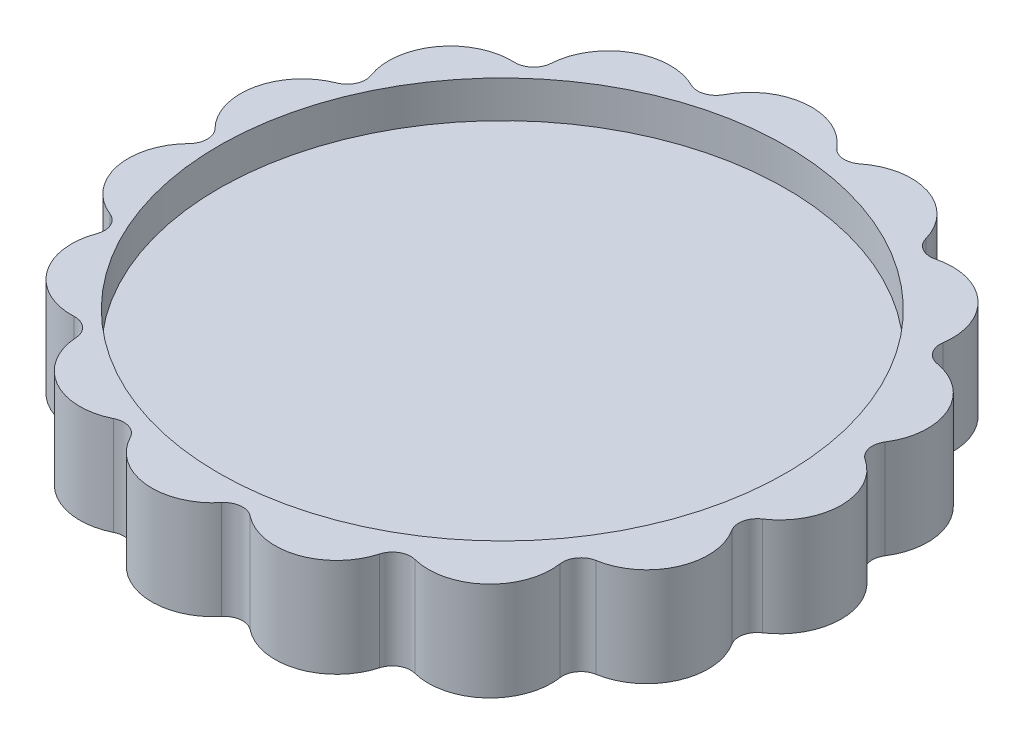
ISO-10303-21;
HEADER;
FILE_DESCRIPTION(('STEP AP214'),'2;1');
FILE_NAME('part.step','',(''),(''),'','','');
FILE_SCHEMA(('AUTOMOTIVE_DESIGN { 1 0 10303 214 1 1 1 1 }'));
ENDSEC;
DATA;
#1=APPLICATION_CONTEXT('core data for automotive mechanical design processes');
#2=APPLICATION_PROTOCOL_DEFINITION('international standard','automotive_design',2000,#1);
#3=PRODUCT_CONTEXT('',#1,'mechanical');
#4=PRODUCT('Part','Part','',(#3));
#5=PRODUCT_RELATED_PRODUCT_CATEGORY('part','',(#4));
#6=PRODUCT_DEFINITION_FORMATION('','',#4);
#7=PRODUCT_DEFINITION_CONTEXT('part definition',#1,'design');
#8=PRODUCT_DEFINITION('design','',#6,#7);
#9=PRODUCT_DEFINITION_SHAPE('','',#8);
#10=(LENGTH_UNIT() NAMED_UNIT(*) SI_UNIT(.MILLI.,.METRE.));
#11=(NAMED_UNIT(*) PLANE_ANGLE_UNIT() SI_UNIT($,.RADIAN.));
#12=(NAMED_UNIT(*) SI_UNIT($,.STERADIAN.) SOLID_ANGLE_UNIT());
#13=UNCERTAINTY_MEASURE_WITH_UNIT(LENGTH_MEASURE(1.E-05),#10,'distance_accuracy_value','');
#14=(GEOMETRIC_REPRESENTATION_CONTEXT(3) GLOBAL_UNCERTAINTY_ASSIGNED_CONTEXT((#13)) GLOBAL_UNIT_ASSIGNED_CONTEXT((#10,
#11,#12)) REPRESENTATION_CONTEXT('',''));
#15=CARTESIAN_POINT('',(0.,0.,0.));
#16=DIRECTION('',(0.,0.,1.));
#17=DIRECTION('',(1.,0.,0.));
#18=AXIS2_PLACEMENT_3D('',#15,#16,#17);
#19=CARTESIAN_POINT('',(0.,8.,0.));
#20=DIRECTION('',(0.,1.,0.));
#21=DIRECTION('',(0.,0.,1.));
#22=AXIS2_PLACEMENT_3D('',#19,#20,#21);
#23=PLANE('',#22);
#24=CARTESIAN_POINT('',(0.,8.,0.));
#25=DIRECTION('',(0.,1.,0.));
#26=DIRECTION('',(0.,0.,1.));
#27=AXIS2_PLACEMENT_3D('',#24,#25,#26);
#28=CIRCLE('',#27,23.);
#29=CARTESIAN_POINT('',(0.,8.,23.));
#30=VERTEX_POINT('',#29);
#31=EDGE_CURVE('E937',#30,#30,#28,.T.);
#32=ORIENTED_EDGE('',*,*,#31,.F.);
#33=EDGE_LOOP('',(#32));
#34=FACE_BOUND('',#33,.T.);
#35=CARTESIAN_POINT('',(20.6082024489469,8.,8.90020771972226));
#36=DIRECTION('',(0.,1.,0.));
#37=DIRECTION('',(-0.406736643075789,0.,0.913545457642606));
#38=AXIS2_PLACEMENT_3D('',#35,#36,#37);
#39=CIRCLE('',#38,5.);
#40=CARTESIAN_POINT('',(21.4402304030813,8.,13.830494677247));
#41=VERTEX_POINT('',#40);
#42=CARTESIAN_POINT('',(24.8288550590076,8.,6.21951908707809));
#43=VERTEX_POINT('',#42);
#44=EDGE_CURVE('E932',#41,#43,#39,.T.);
#45=ORIENTED_EDGE('',*,*,#44,.T.);
#46=CARTESIAN_POINT('',(26.0950508420258,8.,5.41531249728484));
#47=DIRECTION('',(0.,1.,0.));
#48=DIRECTION('',(0.,0.,1.));
#49=AXIS2_PLACEMENT_3D('',#46,#47,#48);
#50=CIRCLE('',#49,1.5);
#51=CARTESIAN_POINT('',(25.2654237246353,8.,4.16562499791141));
#52=VERTEX_POINT('',#51);
#53=EDGE_CURVE('E376',#43,#52,#50,.F.);
#54=ORIENTED_EDGE('',*,*,#53,.T.);
#55=CARTESIAN_POINT('',(22.5,8.,0.));
#56=DIRECTION('',(0.,1.,0.));
#57=DIRECTION('',(0.,0.,1.));
#58=AXIS2_PLACEMENT_3D('',#55,#56,#57);
#59=CIRCLE('',#58,5.);
#60=CARTESIAN_POINT('',(25.2654237246351,8.,-4.16562499791152));
#61=VERTEX_POINT('',#60);
#62=EDGE_CURVE('E455',#52,#61,#59,.T.);
#63=ORIENTED_EDGE('',*,*,#62,.T.);
#64=CARTESIAN_POINT('',(26.0950508420256,8.,-5.41531249728497));
#65=DIRECTION('',(0.,1.,0.));
#66=DIRECTION('',(0.,0.,1.));
#67=AXIS2_PLACEMENT_3D('',#64,#65,#66);
#68=CIRCLE('',#67,1.5);
#69=CARTESIAN_POINT('',(24.8288550590074,8.,-6.21951908707826));
#70=VERTEX_POINT('',#69);
#71=EDGE_CURVE('E381',#61,#70,#68,.F.);
#72=ORIENTED_EDGE('',*,*,#71,.T.);
#73=CARTESIAN_POINT('',(20.6082024489468,8.,-8.90020771972253));
#74=DIRECTION('',(0.,1.,0.));
#75=DIRECTION('',(0.406736643075801,0.,0.913545457642601));
#76=AXIS2_PLACEMENT_3D('',#73,#74,#75);
#77=CIRCLE('',#76,5.);
#78=CARTESIAN_POINT('',(21.4402304030811,8.,-13.8304946772473));
#79=VERTEX_POINT('',#78);
#80=EDGE_CURVE('E239',#70,#79,#77,.T.);
#81=ORIENTED_EDGE('',*,*,#80,.T.);
#82=CARTESIAN_POINT('',(21.6898387893214,8.,-15.3095807645048));
#83=DIRECTION('',(0.,1.,0.));
#84=DIRECTION('',(0.,0.,1.));
#85=AXIS2_PLACEMENT_3D('',#82,#83,#84);
#86=CIRCLE('',#85,1.5);
#87=CARTESIAN_POINT('',(20.2060110945869,8.,-15.5292518193551));
#88=VERTEX_POINT('',#87);
#89=EDGE_CURVE('E233',#79,#88,#86,.F.);
#90=ORIENTED_EDGE('',*,*,#89,.T.);
#91=CARTESIAN_POINT('',(15.2599187788055,8.,-16.2614886688562));
#92=DIRECTION('',(0.,1.,0.));
#93=DIRECTION('',(0.743144825477395,0.,0.669130606358857));
#94=AXIS2_PLACEMENT_3D('',#91,#92,#93);
#95=CIRCLE('',#94,5.);
#96=CARTESIAN_POINT('',(14.0146857704325,8.,-21.1039461807874));
#97=VERTEX_POINT('',#96);
#98=EDGE_CURVE('E236',#88,#97,#95,.T.);
#99=ORIENTED_EDGE('',*,*,#98,.T.);
#100=CARTESIAN_POINT('',(13.6411158679206,8.,-22.5566834343667));
#101=DIRECTION('',(0.,1.,0.));
#102=DIRECTION('',(0.,0.,1.));
#103=AXIS2_PLACEMENT_3D('',#100,#101,#102);
#104=CIRCLE('',#103,1.5);
#105=CARTESIAN_POINT('',(12.1962235500409,8.,-22.1538358332416));
#106=VERTEX_POINT('',#105);
#107=EDGE_CURVE('E334',#97,#106,#104,.F.);
#108=ORIENTED_EDGE('',*,*,#107,.T.);
#109=CARTESIAN_POINT('',(7.37991582377525,8.,-20.811010496158));
#110=DIRECTION('',(0.,1.,0.));
#111=DIRECTION('',(0.951056516295154,0.,0.309016994374945));
#112=AXIS2_PLACEMENT_3D('',#109,#110,#111);
#113=CIRCLE('',#112,5.);
#114=CARTESIAN_POINT('',(4.27273395262942,8.,-24.7283336663371));
#115=VERTEX_POINT('',#114);
#116=EDGE_CURVE('E444',#106,#115,#113,.T.);
#117=ORIENTED_EDGE('',*,*,#116,.T.);
#118=CARTESIAN_POINT('',(3.34057939128567,8.,-25.9035306173909));
#119=DIRECTION('',(0.,1.,0.));
#120=DIRECTION('',(0.,0.,1.));
#121=AXIS2_PLACEMENT_3D('',#118,#119,#120);
#122=CIRCLE('',#121,1.5);
#123=CARTESIAN_POINT('',(2.18445745845675,8.,-24.9478203702804));
#124=VERTEX_POINT('',#123);
#125=EDGE_CURVE('E338',#115,#124,#122,.F.);
#126=ORIENTED_EDGE('',*,*,#125,.T.);
#127=CARTESIAN_POINT('',(-1.66928231763964,8.,-21.7621195465789));
#128=DIRECTION('',(0.,1.,0.));
#129=DIRECTION('',(0.994521895368273,0.,-0.104528463267657));
#130=AXIS2_PLACEMENT_3D('',#127,#128,#129);
#131=CIRCLE('',#130,5.);
#132=CARTESIAN_POINT('',(-6.10115307817609,8.,-24.0769676111184));
#133=VERTEX_POINT('',#132);
#134=EDGE_CURVE('E438',#124,#133,#131,.T.);
#135=ORIENTED_EDGE('',*,*,#134,.T.);
#136=CARTESIAN_POINT('',(-7.43071430633703,8.,-24.7714220304802));
#137=DIRECTION('',(0.,1.,0.));
#138=DIRECTION('',(0.,0.,1.));
#139=AXIS2_PLACEMENT_3D('',#136,#137,#138);
#140=CIRCLE('',#139,1.5);
#141=CARTESIAN_POINT('',(-8.09816186889102,8.,-23.4281001214648));
#142=VERTEX_POINT('',#141);
#143=EDGE_CURVE('E342',#133,#142,#140,.F.);
#144=ORIENTED_EDGE('',*,*,#143,.T.);
#145=CARTESIAN_POINT('',(-10.3229870774043,8.,-18.9503604247469));
#146=DIRECTION('',(0.,1.,0.));
#147=DIRECTION('',(0.866025403784436,0.,-0.500000000000004));
#148=AXIS2_PLACEMENT_3D('',#145,#146,#147);
#149=CIRCLE('',#148,5.);
#150=CARTESIAN_POINT('',(-15.3132360105527,8.,-19.2624751235533));
#151=VERTEX_POINT('',#150);
#152=EDGE_CURVE('E432',#142,#151,#149,.T.);
#153=ORIENTED_EDGE('',*,*,#152,.T.);
#154=CARTESIAN_POINT('',(-16.8103106904973,8.,-19.3561095331952));
#155=DIRECTION('',(0.,1.,0.));
#156=DIRECTION('',(0.,0.,1.));
#157=AXIS2_PLACEMENT_3D('',#154,#155,#156);
#158=CIRCLE('',#157,1.5);
#159=CARTESIAN_POINT('',(-16.87367613564,8.,-17.8574485240401));
#160=VERTEX_POINT('',#159);
#161=EDGE_CURVE('E346',#151,#160,#158,.F.);
#162=ORIENTED_EDGE('',*,*,#161,.T.);
#163=CARTESIAN_POINT('',(-17.0848942861158,8.,-12.8619118268563));
#164=DIRECTION('',(0.,1.,0.));
#165=DIRECTION('',(0.587785252292469,0.,-0.80901699437495));
#166=AXIS2_PLACEMENT_3D('',#163,#164,#165);
#167=CIRCLE('',#166,5.);
#168=CARTESIAN_POINT('',(-21.7706620163465,8.,-11.117325693033));
#169=VERTEX_POINT('',#168);
#170=EDGE_CURVE('E426',#160,#169,#167,.T.);
#171=ORIENTED_EDGE('',*,*,#170,.T.);
#172=CARTESIAN_POINT('',(-23.1763923354157,8.,-10.593949852886));
#173=DIRECTION('',(0.,1.,0.));
#174=DIRECTION('',(0.,0.,1.));
#175=AXIS2_PLACEMENT_3D('',#172,#173,#174);
#176=CIRCLE('',#175,1.5);
#177=CARTESIAN_POINT('',(-22.624719202025,8.,-9.19908184698192));
#178=VERTEX_POINT('',#177);
#179=EDGE_CURVE('E350',#169,#178,#176,.F.);
#180=ORIENTED_EDGE('',*,*,#179,.T.);
#181=CARTESIAN_POINT('',(-20.7858087573893,8.,-4.54952182730159));
#182=DIRECTION('',(0.,1.,0.));
#183=DIRECTION('',(0.207911690817753,0.,-0.978147600733807));
#184=AXIS2_PLACEMENT_3D('',#181,#182,#183);
#185=CIRCLE('',#184,5.);
#186=CARTESIAN_POINT('',(-24.3568834752819,8.,-1.04988965245408));
#187=VERTEX_POINT('',#186);
#188=EDGE_CURVE('E420',#178,#187,#185,.T.);
#189=ORIENTED_EDGE('',*,*,#188,.T.);
#190=CARTESIAN_POINT('',(-25.4282058906497,8.,1.74941733164748E-13));
#191=DIRECTION('',(0.,1.,0.));
#192=DIRECTION('',(0.,0.,1.));
#193=AXIS2_PLACEMENT_3D('',#190,#191,#192);
#194=CIRCLE('',#193,1.5);
#195=CARTESIAN_POINT('',(-24.3568834752819,8.,1.04988965245441));
#196=VERTEX_POINT('',#195);
#197=EDGE_CURVE('E354',#187,#196,#194,.F.);
#198=ORIENTED_EDGE('',*,*,#197,.T.);
#199=CARTESIAN_POINT('',(-20.7858087573892,8.,4.54952182730187));
#200=DIRECTION('',(0.,1.,0.));
#201=DIRECTION('',(-0.207911690817766,0.,-0.978147600733804));
#202=AXIS2_PLACEMENT_3D('',#199,#200,#201);
#203=CIRCLE('',#202,5.);
#204=CARTESIAN_POINT('',(-22.6247192020249,8.,9.19908184698223));
#205=VERTEX_POINT('',#204);
#206=EDGE_CURVE('E397',#196,#205,#203,.T.);
#207=ORIENTED_EDGE('',*,*,#206,.T.);
#208=CARTESIAN_POINT('',(-23.1763923354155,8.,10.5939498528863));
#209=DIRECTION('',(0.,1.,0.));
#210=DIRECTION('',(0.,0.,1.));
#211=AXIS2_PLACEMENT_3D('',#208,#209,#210);
#212=CIRCLE('',#211,1.5);
#213=CARTESIAN_POINT('',(-21.7706620163463,8.,11.1173256930333));
#214=VERTEX_POINT('',#213);
#215=EDGE_CURVE('E358',#205,#214,#212,.F.);
#216=ORIENTED_EDGE('',*,*,#215,.T.);
#217=CARTESIAN_POINT('',(-17.0848942861156,8.,12.8619118268566));
#218=DIRECTION('',(0.,1.,0.));
#219=DIRECTION('',(-0.58778525229248,0.,-0.809016994374943));
#220=AXIS2_PLACEMENT_3D('',#217,#218,#219);
#221=CIRCLE('',#220,5.);
#222=CARTESIAN_POINT('',(-16.8736761356398,8.,17.8574485240403));
#223=VERTEX_POINT('',#222);
#224=EDGE_CURVE('E398',#214,#223,#221,.T.);
#225=ORIENTED_EDGE('',*,*,#224,.T.);
#226=CARTESIAN_POINT('',(-16.810310690497,8.,19.3561095331955));
#227=DIRECTION('',(0.,1.,0.));
#228=DIRECTION('',(0.,0.,1.));
#229=AXIS2_PLACEMENT_3D('',#226,#227,#228);
#230=CIRCLE('',#229,1.5);
#231=CARTESIAN_POINT('',(-15.3132360105525,8.,19.2624751235535));
#232=VERTEX_POINT('',#231);
#233=EDGE_CURVE('E11',#223,#232,#230,.F.);
#234=ORIENTED_EDGE('',*,*,#233,.T.);
#235=CARTESIAN_POINT('',(-10.3229870774041,8.,18.950360424747));
#236=DIRECTION('',(0.,1.,0.));
#237=DIRECTION('',(-0.866025403784443,0.,-0.499999999999992));
#238=AXIS2_PLACEMENT_3D('',#235,#236,#237);
#239=CIRCLE('',#238,5.);
#240=CARTESIAN_POINT('',(-8.0981618688907,8.,23.428100121465));
#241=VERTEX_POINT('',#240);
#242=EDGE_CURVE('E403',#232,#241,#239,.T.);
#243=ORIENTED_EDGE('',*,*,#242,.T.);
#244=CARTESIAN_POINT('',(-7.43071430633669,8.,24.7714220304803));
#245=DIRECTION('',(0.,1.,0.));
#246=DIRECTION('',(0.,0.,1.));
#247=AXIS2_PLACEMENT_3D('',#244,#245,#246);
#248=CIRCLE('',#247,1.5);
#249=CARTESIAN_POINT('',(-6.10115307817576,8.,24.0769676111185));
#250=VERTEX_POINT('',#249);
#251=EDGE_CURVE('E362',#241,#250,#248,.F.);
#252=ORIENTED_EDGE('',*,*,#251,.T.);
#253=CARTESIAN_POINT('',(-1.66928231763935,8.,21.762119546579));
#254=DIRECTION('',(0.,1.,0.));
#255=DIRECTION('',(-0.994521895368274,0.,-0.104528463267644));
#256=AXIS2_PLACEMENT_3D('',#253,#254,#255);
#257=CIRCLE('',#256,5.);
#258=CARTESIAN_POINT('',(2.18445745845708,8.,24.9478203702804));
#259=VERTEX_POINT('',#258);
#260=EDGE_CURVE('E412',#250,#259,#257,.T.);
#261=ORIENTED_EDGE('',*,*,#260,.T.);
#262=CARTESIAN_POINT('',(3.34057939128601,8.,25.9035306173909));
#263=DIRECTION('',(0.,1.,0.));
#264=DIRECTION('',(0.,0.,1.));
#265=AXIS2_PLACEMENT_3D('',#262,#263,#264);
#266=CIRCLE('',#265,1.5);
#267=CARTESIAN_POINT('',(4.27273395262974,8.,24.7283336663371));
#268=VERTEX_POINT('',#267);
#269=EDGE_CURVE('E366',#259,#268,#266,.F.);
#270=ORIENTED_EDGE('',*,*,#269,.T.);
#271=CARTESIAN_POINT('',(7.37991582377552,8.,20.8110104961579));
#272=DIRECTION('',(0.,1.,0.));
#273=DIRECTION('',(-0.95105651629515,0.,0.309016994374957));
#274=AXIS2_PLACEMENT_3D('',#271,#272,#273);
#275=CIRCLE('',#274,5.);
#276=CARTESIAN_POINT('',(12.1962235500412,8.,22.1538358332415));
#277=VERTEX_POINT('',#276);
#278=EDGE_CURVE('E918',#268,#277,#275,.T.);
#279=ORIENTED_EDGE('',*,*,#278,.T.);
#280=CARTESIAN_POINT('',(13.6411158679209,8.,22.5566834343666));
#281=DIRECTION('',(0.,1.,0.));
#282=DIRECTION('',(0.,0.,1.));
#283=AXIS2_PLACEMENT_3D('',#280,#281,#282);
#284=CIRCLE('',#283,1.5);
#285=CARTESIAN_POINT('',(14.0146857704328,8.,21.1039461807872));
#286=VERTEX_POINT('',#285);
#287=EDGE_CURVE('E370',#277,#286,#284,.F.);
#288=ORIENTED_EDGE('',*,*,#287,.T.);
#289=CARTESIAN_POINT('',(15.2599187788057,8.,16.261488668856));
#290=DIRECTION('',(0.,1.,0.));
#291=DIRECTION('',(-0.743144825477386,0.,0.669130606358867));
#292=AXIS2_PLACEMENT_3D('',#289,#290,#291);
#293=CIRCLE('',#292,5.);
#294=CARTESIAN_POINT('',(20.2060110945872,8.,15.5292518193548));
#295=VERTEX_POINT('',#294);
#296=EDGE_CURVE('E926',#286,#295,#293,.T.);
#297=ORIENTED_EDGE('',*,*,#296,.T.);
#298=CARTESIAN_POINT('',(21.6898387893216,8.,15.3095807645045));
#299=DIRECTION('',(0.,1.,0.));
#300=DIRECTION('',(0.,0.,1.));
#301=AXIS2_PLACEMENT_3D('',#298,#299,#300);
#302=CIRCLE('',#301,1.5);
#303=EDGE_CURVE('E374',#295,#41,#302,.F.);
#304=ORIENTED_EDGE('',*,*,#303,.T.);
#305=EDGE_LOOP('',(#45,#54,#63,#72,#81,#90,#99,#108,#117,#126,#135,#144,#153,#162,#171,#180,
#189,#198,#207,#216,#225,#234,#243,#252,#261,#270,#279,#288,#297,#304));
#306=FACE_BOUND('',#305,.T.);
#307=ADVANCED_FACE('F35',(#34,#306),#23,.T.);
#308=CARTESIAN_POINT('',(0.,0.,0.));
#309=DIRECTION('',(0.,1.,0.));
#310=DIRECTION('',(0.,0.,1.));
#311=AXIS2_PLACEMENT_3D('',#308,#309,#310);
#312=PLANE('',#311);
#313=CARTESIAN_POINT('',(20.6082024489468,0.,-8.90020771972253));
#314=DIRECTION('',(0.,1.,0.));
#315=DIRECTION('',(0.406736643075801,0.,0.913545457642601));
#316=AXIS2_PLACEMENT_3D('',#313,#314,#315);
#317=CIRCLE('',#316,5.);
#318=CARTESIAN_POINT('',(24.8288550590074,0.,-6.21951908707826));
#319=VERTEX_POINT('',#318);
#320=CARTESIAN_POINT('',(21.4402304030811,0.,-13.8304946772473));
#321=VERTEX_POINT('',#320);
#322=EDGE_CURVE('E452',#319,#321,#317,.T.);
#323=ORIENTED_EDGE('',*,*,#322,.F.);
#324=CARTESIAN_POINT('',(26.0950508420256,0.,-5.41531249728497));
#325=DIRECTION('',(0.,1.,0.));
#326=DIRECTION('',(0.,0.,1.));
#327=AXIS2_PLACEMENT_3D('',#324,#325,#326);
#328=CIRCLE('',#327,1.5);
#329=CARTESIAN_POINT('',(25.2654237246351,0.,-4.16562499791152));
#330=VERTEX_POINT('',#329);
#331=EDGE_CURVE('E50',#319,#330,#328,.T.);
#332=ORIENTED_EDGE('',*,*,#331,.T.);
#333=CARTESIAN_POINT('',(22.5,0.,0.));
#334=DIRECTION('',(0.,1.,0.));
#335=DIRECTION('',(0.,0.,1.));
#336=AXIS2_PLACEMENT_3D('',#333,#334,#335);
#337=CIRCLE('',#336,5.);
#338=CARTESIAN_POINT('',(25.2654237246353,0.,4.16562499791141));
#339=VERTEX_POINT('',#338);
#340=EDGE_CURVE('E263',#339,#330,#337,.T.);
#341=ORIENTED_EDGE('',*,*,#340,.F.);
#342=CARTESIAN_POINT('',(26.0950508420258,0.,5.41531249728484));
#343=DIRECTION('',(0.,1.,0.));
#344=DIRECTION('',(0.,0.,1.));
#345=AXIS2_PLACEMENT_3D('',#342,#343,#344);
#346=CIRCLE('',#345,1.5);
#347=CARTESIAN_POINT('',(24.8288550590076,0.,6.21951908707809));
#348=VERTEX_POINT('',#347);
#349=EDGE_CURVE('E378',#339,#348,#346,.T.);
#350=ORIENTED_EDGE('',*,*,#349,.T.);
#351=CARTESIAN_POINT('',(20.6082024489469,0.,8.90020771972226));
#352=DIRECTION('',(0.,1.,0.));
#353=DIRECTION('',(-0.406736643075789,0.,0.913545457642606));
#354=AXIS2_PLACEMENT_3D('',#351,#352,#353);
#355=CIRCLE('',#354,5.);
#356=CARTESIAN_POINT('',(21.4402304030813,0.,13.830494677247));
#357=VERTEX_POINT('',#356);
#358=EDGE_CURVE('E930',#357,#348,#355,.T.);
#359=ORIENTED_EDGE('',*,*,#358,.F.);
#360=CARTESIAN_POINT('',(21.6898387893216,0.,15.3095807645045));
#361=DIRECTION('',(0.,1.,0.));
#362=DIRECTION('',(0.,0.,1.));
#363=AXIS2_PLACEMENT_3D('',#360,#361,#362);
#364=CIRCLE('',#363,1.5);
#365=CARTESIAN_POINT('',(20.2060110945872,0.,15.5292518193548));
#366=VERTEX_POINT('',#365);
#367=EDGE_CURVE('E372',#357,#366,#364,.T.);
#368=ORIENTED_EDGE('',*,*,#367,.T.);
#369=CARTESIAN_POINT('',(15.2599187788057,0.,16.261488668856));
#370=DIRECTION('',(0.,1.,0.));
#371=DIRECTION('',(-0.743144825477386,0.,0.669130606358867));
#372=AXIS2_PLACEMENT_3D('',#369,#370,#371);
#373=CIRCLE('',#372,5.);
#374=CARTESIAN_POINT('',(14.0146857704328,0.,21.1039461807872));
#375=VERTEX_POINT('',#374);
#376=EDGE_CURVE('E922',#375,#366,#373,.T.);
#377=ORIENTED_EDGE('',*,*,#376,.F.);
#378=CARTESIAN_POINT('',(13.6411158679209,0.,22.5566834343666));
#379=DIRECTION('',(0.,1.,0.));
#380=DIRECTION('',(0.,0.,1.));
#381=AXIS2_PLACEMENT_3D('',#378,#379,#380);
#382=CIRCLE('',#381,1.5);
#383=CARTESIAN_POINT('',(12.1962235500412,0.,22.1538358332415));
#384=VERTEX_POINT('',#383);
#385=EDGE_CURVE('E368',#375,#384,#382,.T.);
#386=ORIENTED_EDGE('',*,*,#385,.T.);
#387=CARTESIAN_POINT('',(7.37991582377552,0.,20.8110104961579));
#388=DIRECTION('',(0.,1.,0.));
#389=DIRECTION('',(-0.95105651629515,0.,0.309016994374957));
#390=AXIS2_PLACEMENT_3D('',#387,#388,#389);
#391=CIRCLE('',#390,5.);
#392=CARTESIAN_POINT('',(4.27273395262974,0.,24.7283336663371));
#393=VERTEX_POINT('',#392);
#394=EDGE_CURVE('E913',#393,#384,#391,.T.);
#395=ORIENTED_EDGE('',*,*,#394,.F.);
#396=CARTESIAN_POINT('',(3.34057939128601,0.,25.9035306173909));
#397=DIRECTION('',(0.,1.,0.));
#398=DIRECTION('',(0.,0.,1.));
#399=AXIS2_PLACEMENT_3D('',#396,#397,#398);
#400=CIRCLE('',#399,1.5);
#401=CARTESIAN_POINT('',(2.18445745845708,0.,24.9478203702804));
#402=VERTEX_POINT('',#401);
#403=EDGE_CURVE('E364',#393,#402,#400,.T.);
#404=ORIENTED_EDGE('',*,*,#403,.T.);
#405=CARTESIAN_POINT('',(-1.66928231763935,0.,21.762119546579));
#406=DIRECTION('',(0.,1.,0.));
#407=DIRECTION('',(-0.994521895368274,0.,-0.104528463267644));
#408=AXIS2_PLACEMENT_3D('',#405,#406,#407);
#409=CIRCLE('',#408,5.);
#410=CARTESIAN_POINT('',(-6.10115307817576,0.,24.0769676111185));
#411=VERTEX_POINT('',#410);
#412=EDGE_CURVE('E408',#411,#402,#409,.T.);
#413=ORIENTED_EDGE('',*,*,#412,.F.);
#414=CARTESIAN_POINT('',(-7.43071430633669,0.,24.7714220304803));
#415=DIRECTION('',(0.,1.,0.));
#416=DIRECTION('',(0.,0.,1.));
#417=AXIS2_PLACEMENT_3D('',#414,#415,#416);
#418=CIRCLE('',#417,1.5);
#419=CARTESIAN_POINT('',(-8.0981618688907,0.,23.428100121465));
#420=VERTEX_POINT('',#419);
#421=EDGE_CURVE('E360',#411,#420,#418,.T.);
#422=ORIENTED_EDGE('',*,*,#421,.T.);
#423=CARTESIAN_POINT('',(-10.3229870774041,0.,18.950360424747));
#424=DIRECTION('',(0.,1.,0.));
#425=DIRECTION('',(-0.866025403784443,0.,-0.499999999999992));
#426=AXIS2_PLACEMENT_3D('',#423,#424,#425);
#427=CIRCLE('',#426,5.);
#428=CARTESIAN_POINT('',(-15.3132360105525,0.,19.2624751235535));
#429=VERTEX_POINT('',#428);
#430=EDGE_CURVE('E388',#429,#420,#427,.T.);
#431=ORIENTED_EDGE('',*,*,#430,.F.);
#432=CARTESIAN_POINT('',(-16.810310690497,0.,19.3561095331955));
#433=DIRECTION('',(0.,1.,0.));
#434=DIRECTION('',(0.,0.,1.));
#435=AXIS2_PLACEMENT_3D('',#432,#433,#434);
#436=CIRCLE('',#435,1.5);
#437=CARTESIAN_POINT('',(-16.8736761356398,0.,17.8574485240403));
#438=VERTEX_POINT('',#437);
#439=EDGE_CURVE('E43',#429,#438,#436,.T.);
#440=ORIENTED_EDGE('',*,*,#439,.T.);
#441=CARTESIAN_POINT('',(-17.0848942861156,0.,12.8619118268566));
#442=DIRECTION('',(0.,1.,0.));
#443=DIRECTION('',(-0.58778525229248,0.,-0.809016994374943));
#444=AXIS2_PLACEMENT_3D('',#441,#442,#443);
#445=CIRCLE('',#444,5.);
#446=CARTESIAN_POINT('',(-21.7706620163463,0.,11.1173256930333));
#447=VERTEX_POINT('',#446);
#448=EDGE_CURVE('E386',#447,#438,#445,.T.);
#449=ORIENTED_EDGE('',*,*,#448,.F.);
#450=CARTESIAN_POINT('',(-23.1763923354155,0.,10.5939498528863));
#451=DIRECTION('',(0.,1.,0.));
#452=DIRECTION('',(0.,0.,1.));
#453=AXIS2_PLACEMENT_3D('',#450,#451,#452);
#454=CIRCLE('',#453,1.5);
#455=CARTESIAN_POINT('',(-22.6247192020249,0.,9.19908184698223));
#456=VERTEX_POINT('',#455);
#457=EDGE_CURVE('E356',#447,#456,#454,.T.);
#458=ORIENTED_EDGE('',*,*,#457,.T.);
#459=CARTESIAN_POINT('',(-20.7858087573892,0.,4.54952182730187));
#460=DIRECTION('',(0.,1.,0.));
#461=DIRECTION('',(-0.207911690817766,0.,-0.978147600733804));
#462=AXIS2_PLACEMENT_3D('',#459,#460,#461);
#463=CIRCLE('',#462,5.);
#464=CARTESIAN_POINT('',(-24.3568834752819,0.,1.04988965245441));
#465=VERTEX_POINT('',#464);
#466=EDGE_CURVE('E417',#465,#456,#463,.T.);
#467=ORIENTED_EDGE('',*,*,#466,.F.);
#468=CARTESIAN_POINT('',(-25.4282058906497,0.,1.74941733164748E-13));
#469=DIRECTION('',(0.,1.,0.));
#470=DIRECTION('',(0.,0.,1.));
#471=AXIS2_PLACEMENT_3D('',#468,#469,#470);
#472=CIRCLE('',#471,1.5);
#473=CARTESIAN_POINT('',(-24.3568834752819,0.,-1.04988965245408));
#474=VERTEX_POINT('',#473);
#475=EDGE_CURVE('E352',#465,#474,#472,.T.);
#476=ORIENTED_EDGE('',*,*,#475,.T.);
#477=CARTESIAN_POINT('',(-20.7858087573893,0.,-4.54952182730159));
#478=DIRECTION('',(0.,1.,0.));
#479=DIRECTION('',(0.207911690817753,0.,-0.978147600733807));
#480=AXIS2_PLACEMENT_3D('',#477,#478,#479);
#481=CIRCLE('',#480,5.);
#482=CARTESIAN_POINT('',(-22.624719202025,0.,-9.19908184698192));
#483=VERTEX_POINT('',#482);
#484=EDGE_CURVE('E423',#483,#474,#481,.T.);
#485=ORIENTED_EDGE('',*,*,#484,.F.);
#486=CARTESIAN_POINT('',(-23.1763923354157,0.,-10.593949852886));
#487=DIRECTION('',(0.,1.,0.));
#488=DIRECTION('',(0.,0.,1.));
#489=AXIS2_PLACEMENT_3D('',#486,#487,#488);
#490=CIRCLE('',#489,1.5);
#491=CARTESIAN_POINT('',(-21.7706620163465,0.,-11.117325693033));
#492=VERTEX_POINT('',#491);
#493=EDGE_CURVE('E348',#483,#492,#490,.T.);
#494=ORIENTED_EDGE('',*,*,#493,.T.);
#495=CARTESIAN_POINT('',(-17.0848942861158,0.,-12.8619118268563));
#496=DIRECTION('',(0.,1.,0.));
#497=DIRECTION('',(0.587785252292469,0.,-0.80901699437495));
#498=AXIS2_PLACEMENT_3D('',#495,#496,#497);
#499=CIRCLE('',#498,5.);
#500=CARTESIAN_POINT('',(-16.87367613564,0.,-17.8574485240401));
#501=VERTEX_POINT('',#500);
#502=EDGE_CURVE('E429',#501,#492,#499,.T.);
#503=ORIENTED_EDGE('',*,*,#502,.F.);
#504=CARTESIAN_POINT('',(-16.8103106904973,0.,-19.3561095331952));
#505=DIRECTION('',(0.,1.,0.));
#506=DIRECTION('',(0.,0.,1.));
#507=AXIS2_PLACEMENT_3D('',#504,#505,#506);
#508=CIRCLE('',#507,1.5);
#509=CARTESIAN_POINT('',(-15.3132360105527,0.,-19.2624751235533));
#510=VERTEX_POINT('',#509);
#511=EDGE_CURVE('E344',#501,#510,#508,.T.);
#512=ORIENTED_EDGE('',*,*,#511,.T.);
#513=CARTESIAN_POINT('',(-10.3229870774043,0.,-18.9503604247469));
#514=DIRECTION('',(0.,1.,0.));
#515=DIRECTION('',(0.866025403784436,0.,-0.500000000000004));
#516=AXIS2_PLACEMENT_3D('',#513,#514,#515);
#517=CIRCLE('',#516,5.);
#518=CARTESIAN_POINT('',(-8.09816186889102,0.,-23.4281001214648));
#519=VERTEX_POINT('',#518);
#520=EDGE_CURVE('E435',#519,#510,#517,.T.);
#521=ORIENTED_EDGE('',*,*,#520,.F.);
#522=CARTESIAN_POINT('',(-7.43071430633703,0.,-24.7714220304802));
#523=DIRECTION('',(0.,1.,0.));
#524=DIRECTION('',(0.,0.,1.));
#525=AXIS2_PLACEMENT_3D('',#522,#523,#524);
#526=CIRCLE('',#525,1.5);
#527=CARTESIAN_POINT('',(-6.10115307817609,0.,-24.0769676111184));
#528=VERTEX_POINT('',#527);
#529=EDGE_CURVE('E340',#519,#528,#526,.T.);
#530=ORIENTED_EDGE('',*,*,#529,.T.);
#531=CARTESIAN_POINT('',(-1.66928231763964,0.,-21.7621195465789));
#532=DIRECTION('',(0.,1.,0.));
#533=DIRECTION('',(0.994521895368273,0.,-0.104528463267657));
#534=AXIS2_PLACEMENT_3D('',#531,#532,#533);
#535=CIRCLE('',#534,5.);
#536=CARTESIAN_POINT('',(2.18445745845675,0.,-24.9478203702804));
#537=VERTEX_POINT('',#536);
#538=EDGE_CURVE('E441',#537,#528,#535,.T.);
#539=ORIENTED_EDGE('',*,*,#538,.F.);
#540=CARTESIAN_POINT('',(3.34057939128567,0.,-25.9035306173909));
#541=DIRECTION('',(0.,1.,0.));
#542=DIRECTION('',(0.,0.,1.));
#543=AXIS2_PLACEMENT_3D('',#540,#541,#542);
#544=CIRCLE('',#543,1.5);
#545=CARTESIAN_POINT('',(4.27273395262942,0.,-24.7283336663371));
#546=VERTEX_POINT('',#545);
#547=EDGE_CURVE('E336',#537,#546,#544,.T.);
#548=ORIENTED_EDGE('',*,*,#547,.T.);
#549=CARTESIAN_POINT('',(7.37991582377525,0.,-20.811010496158));
#550=DIRECTION('',(0.,1.,0.));
#551=DIRECTION('',(0.951056516295154,0.,0.309016994374945));
#552=AXIS2_PLACEMENT_3D('',#549,#550,#551);
#553=CIRCLE('',#552,5.);
#554=CARTESIAN_POINT('',(12.1962235500409,0.,-22.1538358332416));
#555=VERTEX_POINT('',#554);
#556=EDGE_CURVE('E255',#555,#546,#553,.T.);
#557=ORIENTED_EDGE('',*,*,#556,.F.);
#558=CARTESIAN_POINT('',(13.6411158679206,0.,-22.5566834343667));
#559=DIRECTION('',(0.,1.,0.));
#560=DIRECTION('',(0.,0.,1.));
#561=AXIS2_PLACEMENT_3D('',#558,#559,#560);
#562=CIRCLE('',#561,1.5);
#563=CARTESIAN_POINT('',(14.0146857704325,0.,-21.1039461807874));
#564=VERTEX_POINT('',#563);
#565=EDGE_CURVE('E243',#555,#564,#562,.T.);
#566=ORIENTED_EDGE('',*,*,#565,.T.);
#567=CARTESIAN_POINT('',(15.2599187788055,0.,-16.2614886688562));
#568=DIRECTION('',(0.,1.,0.));
#569=DIRECTION('',(0.743144825477395,0.,0.669130606358857));
#570=AXIS2_PLACEMENT_3D('',#567,#568,#569);
#571=CIRCLE('',#570,5.);
#572=CARTESIAN_POINT('',(20.2060110945869,0.,-15.5292518193551));
#573=VERTEX_POINT('',#572);
#574=EDGE_CURVE('E254',#573,#564,#571,.T.);
#575=ORIENTED_EDGE('',*,*,#574,.F.);
#576=CARTESIAN_POINT('',(21.6898387893214,0.,-15.3095807645048));
#577=DIRECTION('',(0.,1.,0.));
#578=DIRECTION('',(0.,0.,1.));
#579=AXIS2_PLACEMENT_3D('',#576,#577,#578);
#580=CIRCLE('',#579,1.5);
#581=EDGE_CURVE('E244',#573,#321,#580,.T.);
#582=ORIENTED_EDGE('',*,*,#581,.T.);
#583=EDGE_LOOP('',(#323,#332,#341,#350,#359,#368,#377,#386,#395,#404,#413,#422,#431,#440,#449,
#458,#467,#476,#485,#494,#503,#512,#521,#530,#539,#548,#557,#566,#575,#582));
#584=FACE_BOUND('',#583,.T.);
#585=ADVANCED_FACE('F385',(#584),#312,.F.);
#586=CARTESIAN_POINT('',(22.5,0.,0.));
#587=DIRECTION('',(0.,1.,0.));
#588=DIRECTION('',(0.,0.,1.));
#589=AXIS2_PLACEMENT_3D('',#586,#587,#588);
#590=CYLINDRICAL_SURFACE('',#589,5.);
#591=ORIENTED_EDGE('',*,*,#62,.F.);
#592=DIRECTION('',(0.,1.,0.));
#593=VECTOR('',#592,1.);
#594=CARTESIAN_POINT('',(25.2654237246353,0.,4.16562499791141));
#595=LINE('',#594,#593);
#596=EDGE_CURVE('E57',#52,#339,#595,.F.);
#597=ORIENTED_EDGE('',*,*,#596,.T.);
#598=ORIENTED_EDGE('',*,*,#340,.T.);
#599=DIRECTION('',(0.,1.,0.));
#600=VECTOR('',#599,1.);
#601=CARTESIAN_POINT('',(25.2654237246351,0.,-4.16562499791152));
#602=LINE('',#601,#600);
#603=EDGE_CURVE('E329',#330,#61,#602,.T.);
#604=ORIENTED_EDGE('',*,*,#603,.T.);
#605=EDGE_LOOP('',(#591,#597,#598,#604));
#606=FACE_BOUND('',#605,.T.);
#607=ADVANCED_FACE('F538',(#606),#590,.T.);
#608=CARTESIAN_POINT('',(20.6082024489468,0.,-8.90020771972253));
#609=DIRECTION('',(0.,1.,0.));
#610=DIRECTION('',(0.,0.,1.));
#611=AXIS2_PLACEMENT_3D('',#608,#609,#610);
#612=CYLINDRICAL_SURFACE('',#611,5.);
#613=ORIENTED_EDGE('',*,*,#322,.T.);
#614=DIRECTION('',(0.,1.,0.));
#615=VECTOR('',#614,1.);
#616=CARTESIAN_POINT('',(21.4402304030811,0.,-13.8304946772473));
#617=LINE('',#616,#615);
#618=EDGE_CURVE('E261',#321,#79,#617,.T.);
#619=ORIENTED_EDGE('',*,*,#618,.T.);
#620=ORIENTED_EDGE('',*,*,#80,.F.);
#621=DIRECTION('',(0.,1.,0.));
#622=VECTOR('',#621,1.);
#623=CARTESIAN_POINT('',(24.8288550590074,0.,-6.21951908707826));
#624=LINE('',#623,#622);
#625=EDGE_CURVE('E258',#70,#319,#624,.F.);
#626=ORIENTED_EDGE('',*,*,#625,.T.);
#627=EDGE_LOOP('',(#613,#619,#620,#626));
#628=FACE_BOUND('',#627,.T.);
#629=ADVANCED_FACE('F464',(#628),#612,.T.);
#630=CARTESIAN_POINT('',(15.2599187788055,0.,-16.2614886688562));
#631=DIRECTION('',(0.,1.,0.));
#632=DIRECTION('',(0.,0.,1.));
#633=AXIS2_PLACEMENT_3D('',#630,#631,#632);
#634=CYLINDRICAL_SURFACE('',#633,5.);
#635=ORIENTED_EDGE('',*,*,#98,.F.);
#636=DIRECTION('',(0.,1.,0.));
#637=VECTOR('',#636,1.);
#638=CARTESIAN_POINT('',(20.2060110945869,0.,-15.5292518193551));
#639=LINE('',#638,#637);
#640=EDGE_CURVE('E250',#88,#573,#639,.F.);
#641=ORIENTED_EDGE('',*,*,#640,.T.);
#642=ORIENTED_EDGE('',*,*,#574,.T.);
#643=DIRECTION('',(0.,1.,0.));
#644=VECTOR('',#643,1.);
#645=CARTESIAN_POINT('',(14.0146857704325,0.,-21.1039461807874));
#646=LINE('',#645,#644);
#647=EDGE_CURVE('E253',#564,#97,#646,.T.);
#648=ORIENTED_EDGE('',*,*,#647,.T.);
#649=EDGE_LOOP('',(#635,#641,#642,#648));
#650=FACE_BOUND('',#649,.T.);
#651=ADVANCED_FACE('F248',(#650),#634,.T.);
#652=CARTESIAN_POINT('',(7.37991582377525,0.,-20.811010496158));
#653=DIRECTION('',(0.,1.,0.));
#654=DIRECTION('',(0.,0.,1.));
#655=AXIS2_PLACEMENT_3D('',#652,#653,#654);
#656=CYLINDRICAL_SURFACE('',#655,5.);
#657=ORIENTED_EDGE('',*,*,#116,.F.);
#658=DIRECTION('',(0.,1.,0.));
#659=VECTOR('',#658,1.);
#660=CARTESIAN_POINT('',(12.1962235500409,0.,-22.1538358332416));
#661=LINE('',#660,#659);
#662=EDGE_CURVE('E270',#106,#555,#661,.F.);
#663=ORIENTED_EDGE('',*,*,#662,.T.);
#664=ORIENTED_EDGE('',*,*,#556,.T.);
#665=DIRECTION('',(0.,1.,0.));
#666=VECTOR('',#665,1.);
#667=CARTESIAN_POINT('',(4.27273395262942,0.,-24.7283336663371));
#668=LINE('',#667,#666);
#669=EDGE_CURVE('E268',#546,#115,#668,.T.);
#670=ORIENTED_EDGE('',*,*,#669,.T.);
#671=EDGE_LOOP('',(#657,#663,#664,#670));
#672=FACE_BOUND('',#671,.T.);
#673=ADVANCED_FACE('F472',(#672),#656,.T.);
#674=CARTESIAN_POINT('',(-1.66928231763964,0.,-21.7621195465789));
#675=DIRECTION('',(0.,1.,0.));
#676=DIRECTION('',(0.,0.,1.));
#677=AXIS2_PLACEMENT_3D('',#674,#675,#676);
#678=CYLINDRICAL_SURFACE('',#677,5.);
#679=ORIENTED_EDGE('',*,*,#134,.F.);
#680=DIRECTION('',(0.,1.,0.));
#681=VECTOR('',#680,1.);
#682=CARTESIAN_POINT('',(2.18445745845675,0.,-24.9478203702804));
#683=LINE('',#682,#681);
#684=EDGE_CURVE('E275',#124,#537,#683,.F.);
#685=ORIENTED_EDGE('',*,*,#684,.T.);
#686=ORIENTED_EDGE('',*,*,#538,.T.);
#687=DIRECTION('',(0.,1.,0.));
#688=VECTOR('',#687,1.);
#689=CARTESIAN_POINT('',(-6.10115307817609,0.,-24.0769676111184));
#690=LINE('',#689,#688);
#691=EDGE_CURVE('E273',#528,#133,#690,.T.);
#692=ORIENTED_EDGE('',*,*,#691,.T.);
#693=EDGE_LOOP('',(#679,#685,#686,#692));
#694=FACE_BOUND('',#693,.T.);
#695=ADVANCED_FACE('F480',(#694),#678,.T.);
#696=CARTESIAN_POINT('',(-10.3229870774043,0.,-18.9503604247469));
#697=DIRECTION('',(0.,1.,0.));
#698=DIRECTION('',(0.,0.,1.));
#699=AXIS2_PLACEMENT_3D('',#696,#697,#698);
#700=CYLINDRICAL_SURFACE('',#699,5.);
#701=ORIENTED_EDGE('',*,*,#152,.F.);
#702=DIRECTION('',(0.,1.,0.));
#703=VECTOR('',#702,1.);
#704=CARTESIAN_POINT('',(-8.09816186889102,0.,-23.4281001214648));
#705=LINE('',#704,#703);
#706=EDGE_CURVE('E280',#142,#519,#705,.F.);
#707=ORIENTED_EDGE('',*,*,#706,.T.);
#708=ORIENTED_EDGE('',*,*,#520,.T.);
#709=DIRECTION('',(0.,1.,0.));
#710=VECTOR('',#709,1.);
#711=CARTESIAN_POINT('',(-15.3132360105527,0.,-19.2624751235533));
#712=LINE('',#711,#710);
#713=EDGE_CURVE('E278',#510,#151,#712,.T.);
#714=ORIENTED_EDGE('',*,*,#713,.T.);
#715=EDGE_LOOP('',(#701,#707,#708,#714));
#716=FACE_BOUND('',#715,.T.);
#717=ADVANCED_FACE('F489',(#716),#700,.T.);
#718=CARTESIAN_POINT('',(-17.0848942861158,0.,-12.8619118268563));
#719=DIRECTION('',(0.,1.,0.));
#720=DIRECTION('',(0.,0.,1.));
#721=AXIS2_PLACEMENT_3D('',#718,#719,#720);
#722=CYLINDRICAL_SURFACE('',#721,5.);
#723=ORIENTED_EDGE('',*,*,#170,.F.);
#724=DIRECTION('',(0.,1.,0.));
#725=VECTOR('',#724,1.);
#726=CARTESIAN_POINT('',(-16.87367613564,0.,-17.8574485240401));
#727=LINE('',#726,#725);
#728=EDGE_CURVE('E285',#160,#501,#727,.F.);
#729=ORIENTED_EDGE('',*,*,#728,.T.);
#730=ORIENTED_EDGE('',*,*,#502,.T.);
#731=DIRECTION('',(0.,1.,0.));
#732=VECTOR('',#731,1.);
#733=CARTESIAN_POINT('',(-21.7706620163465,0.,-11.117325693033));
#734=LINE('',#733,#732);
#735=EDGE_CURVE('E283',#492,#169,#734,.T.);
#736=ORIENTED_EDGE('',*,*,#735,.T.);
#737=EDGE_LOOP('',(#723,#729,#730,#736));
#738=FACE_BOUND('',#737,.T.);
#739=ADVANCED_FACE('F498',(#738),#722,.T.);
#740=CARTESIAN_POINT('',(-20.7858087573893,0.,-4.54952182730159));
#741=DIRECTION('',(0.,1.,0.));
#742=DIRECTION('',(0.,0.,1.));
#743=AXIS2_PLACEMENT_3D('',#740,#741,#742);
#744=CYLINDRICAL_SURFACE('',#743,5.);
#745=ORIENTED_EDGE('',*,*,#188,.F.);
#746=DIRECTION('',(0.,1.,0.));
#747=VECTOR('',#746,1.);
#748=CARTESIAN_POINT('',(-22.624719202025,0.,-9.19908184698192));
#749=LINE('',#748,#747);
#750=EDGE_CURVE('E290',#178,#483,#749,.F.);
#751=ORIENTED_EDGE('',*,*,#750,.T.);
#752=ORIENTED_EDGE('',*,*,#484,.T.);
#753=DIRECTION('',(0.,1.,0.));
#754=VECTOR('',#753,1.);
#755=CARTESIAN_POINT('',(-24.3568834752819,0.,-1.04988965245408));
#756=LINE('',#755,#754);
#757=EDGE_CURVE('E288',#474,#187,#756,.T.);
#758=ORIENTED_EDGE('',*,*,#757,.T.);
#759=EDGE_LOOP('',(#745,#751,#752,#758));
#760=FACE_BOUND('',#759,.T.);
#761=ADVANCED_FACE('F507',(#760),#744,.T.);
#762=CARTESIAN_POINT('',(-20.7858087573892,0.,4.54952182730187));
#763=DIRECTION('',(0.,1.,0.));
#764=DIRECTION('',(0.,0.,1.));
#765=AXIS2_PLACEMENT_3D('',#762,#763,#764);
#766=CYLINDRICAL_SURFACE('',#765,5.);
#767=ORIENTED_EDGE('',*,*,#206,.F.);
#768=DIRECTION('',(0.,1.,0.));
#769=VECTOR('',#768,1.);
#770=CARTESIAN_POINT('',(-24.3568834752819,0.,1.04988965245441));
#771=LINE('',#770,#769);
#772=EDGE_CURVE('E295',#196,#465,#771,.F.);
#773=ORIENTED_EDGE('',*,*,#772,.T.);
#774=ORIENTED_EDGE('',*,*,#466,.T.);
#775=DIRECTION('',(0.,1.,0.));
#776=VECTOR('',#775,1.);
#777=CARTESIAN_POINT('',(-22.6247192020249,0.,9.19908184698223));
#778=LINE('',#777,#776);
#779=EDGE_CURVE('E293',#456,#205,#778,.T.);
#780=ORIENTED_EDGE('',*,*,#779,.T.);
#781=EDGE_LOOP('',(#767,#773,#774,#780));
#782=FACE_BOUND('',#781,.T.);
#783=ADVANCED_FACE('F516',(#782),#766,.T.);
#784=CARTESIAN_POINT('',(-17.0848942861156,0.,12.8619118268566));
#785=DIRECTION('',(0.,1.,0.));
#786=DIRECTION('',(0.,0.,1.));
#787=AXIS2_PLACEMENT_3D('',#784,#785,#786);
#788=CYLINDRICAL_SURFACE('',#787,5.);
#789=ORIENTED_EDGE('',*,*,#224,.F.);
#790=DIRECTION('',(0.,1.,0.));
#791=VECTOR('',#790,1.);
#792=CARTESIAN_POINT('',(-21.7706620163463,0.,11.1173256930333));
#793=LINE('',#792,#791);
#794=EDGE_CURVE('E300',#214,#447,#793,.F.);
#795=ORIENTED_EDGE('',*,*,#794,.T.);
#796=ORIENTED_EDGE('',*,*,#448,.T.);
#797=DIRECTION('',(0.,1.,0.));
#798=VECTOR('',#797,1.);
#799=CARTESIAN_POINT('',(-16.8736761356398,0.,17.8574485240403));
#800=LINE('',#799,#798);
#801=EDGE_CURVE('E298',#438,#223,#800,.T.);
#802=ORIENTED_EDGE('',*,*,#801,.T.);
#803=EDGE_LOOP('',(#789,#795,#796,#802));
#804=FACE_BOUND('',#803,.T.);
#805=ADVANCED_FACE('F394',(#804),#788,.T.);
#806=CARTESIAN_POINT('',(-10.3229870774041,0.,18.950360424747));
#807=DIRECTION('',(0.,1.,0.));
#808=DIRECTION('',(0.,0.,1.));
#809=AXIS2_PLACEMENT_3D('',#806,#807,#808);
#810=CYLINDRICAL_SURFACE('',#809,5.);
#811=ORIENTED_EDGE('',*,*,#430,.T.);
#812=DIRECTION('',(0.,1.,0.));
#813=VECTOR('',#812,1.);
#814=CARTESIAN_POINT('',(-8.0981618688907,0.,23.428100121465));
#815=LINE('',#814,#813);
#816=EDGE_CURVE('E311',#420,#241,#815,.T.);
#817=ORIENTED_EDGE('',*,*,#816,.T.);
#818=ORIENTED_EDGE('',*,*,#242,.F.);
#819=DIRECTION('',(0.,1.,0.));
#820=VECTOR('',#819,1.);
#821=CARTESIAN_POINT('',(-15.3132360105525,0.,19.2624751235535));
#822=LINE('',#821,#820);
#823=EDGE_CURVE('E308',#232,#429,#822,.F.);
#824=ORIENTED_EDGE('',*,*,#823,.T.);
#825=EDGE_LOOP('',(#811,#817,#818,#824));
#826=FACE_BOUND('',#825,.T.);
#827=ADVANCED_FACE('F406',(#826),#810,.T.);
#828=CARTESIAN_POINT('',(-1.66928231763935,0.,21.762119546579));
#829=DIRECTION('',(0.,1.,0.));
#830=DIRECTION('',(0.,0.,1.));
#831=AXIS2_PLACEMENT_3D('',#828,#829,#830);
#832=CYLINDRICAL_SURFACE('',#831,5.);
#833=ORIENTED_EDGE('',*,*,#260,.F.);
#834=DIRECTION('',(0.,1.,0.));
#835=VECTOR('',#834,1.);
#836=CARTESIAN_POINT('',(-6.10115307817576,0.,24.0769676111185));
#837=LINE('',#836,#835);
#838=EDGE_CURVE('E305',#250,#411,#837,.F.);
#839=ORIENTED_EDGE('',*,*,#838,.T.);
#840=ORIENTED_EDGE('',*,*,#412,.T.);
#841=DIRECTION('',(0.,1.,0.));
#842=VECTOR('',#841,1.);
#843=CARTESIAN_POINT('',(2.18445745845708,0.,24.9478203702804));
#844=LINE('',#843,#842);
#845=EDGE_CURVE('E303',#402,#259,#844,.T.);
#846=ORIENTED_EDGE('',*,*,#845,.T.);
#847=EDGE_LOOP('',(#833,#839,#840,#846));
#848=FACE_BOUND('',#847,.T.);
#849=ADVANCED_FACE('F669',(#848),#832,.T.);
#850=CARTESIAN_POINT('',(7.37991582377552,0.,20.8110104961579));
#851=DIRECTION('',(0.,1.,0.));
#852=DIRECTION('',(0.,0.,1.));
#853=AXIS2_PLACEMENT_3D('',#850,#851,#852);
#854=CYLINDRICAL_SURFACE('',#853,5.);
#855=ORIENTED_EDGE('',*,*,#278,.F.);
#856=DIRECTION('',(0.,1.,0.));
#857=VECTOR('',#856,1.);
#858=CARTESIAN_POINT('',(4.27273395262974,0.,24.7283336663371));
#859=LINE('',#858,#857);
#860=EDGE_CURVE('E315',#268,#393,#859,.F.);
#861=ORIENTED_EDGE('',*,*,#860,.T.);
#862=ORIENTED_EDGE('',*,*,#394,.T.);
#863=DIRECTION('',(0.,1.,0.));
#864=VECTOR('',#863,1.);
#865=CARTESIAN_POINT('',(12.1962235500412,0.,22.1538358332415));
#866=LINE('',#865,#864);
#867=EDGE_CURVE('E313',#384,#277,#866,.T.);
#868=ORIENTED_EDGE('',*,*,#867,.T.);
#869=EDGE_LOOP('',(#855,#861,#862,#868));
#870=FACE_BOUND('',#869,.T.);
#871=ADVANCED_FACE('F665',(#870),#854,.T.);
#872=CARTESIAN_POINT('',(15.2599187788057,0.,16.261488668856));
#873=DIRECTION('',(0.,1.,0.));
#874=DIRECTION('',(0.,0.,1.));
#875=AXIS2_PLACEMENT_3D('',#872,#873,#874);
#876=CYLINDRICAL_SURFACE('',#875,5.);
#877=ORIENTED_EDGE('',*,*,#296,.F.);
#878=DIRECTION('',(0.,1.,0.));
#879=VECTOR('',#878,1.);
#880=CARTESIAN_POINT('',(14.0146857704328,0.,21.1039461807872));
#881=LINE('',#880,#879);
#882=EDGE_CURVE('E320',#286,#375,#881,.F.);
#883=ORIENTED_EDGE('',*,*,#882,.T.);
#884=ORIENTED_EDGE('',*,*,#376,.T.);
#885=DIRECTION('',(0.,1.,0.));
#886=VECTOR('',#885,1.);
#887=CARTESIAN_POINT('',(20.2060110945872,0.,15.5292518193548));
#888=LINE('',#887,#886);
#889=EDGE_CURVE('E318',#366,#295,#888,.T.);
#890=ORIENTED_EDGE('',*,*,#889,.T.);
#891=EDGE_LOOP('',(#877,#883,#884,#890));
#892=FACE_BOUND('',#891,.T.);
#893=ADVANCED_FACE('F661',(#892),#876,.T.);
#894=CARTESIAN_POINT('',(20.6082024489469,0.,8.90020771972226));
#895=DIRECTION('',(0.,1.,0.));
#896=DIRECTION('',(0.,0.,1.));
#897=AXIS2_PLACEMENT_3D('',#894,#895,#896);
#898=CYLINDRICAL_SURFACE('',#897,5.);
#899=ORIENTED_EDGE('',*,*,#44,.F.);
#900=DIRECTION('',(0.,1.,0.));
#901=VECTOR('',#900,1.);
#902=CARTESIAN_POINT('',(21.4402304030813,0.,13.830494677247));
#903=LINE('',#902,#901);
#904=EDGE_CURVE('E326',#41,#357,#903,.F.);
#905=ORIENTED_EDGE('',*,*,#904,.T.);
#906=ORIENTED_EDGE('',*,*,#358,.T.);
#907=DIRECTION('',(0.,1.,0.));
#908=VECTOR('',#907,1.);
#909=CARTESIAN_POINT('',(24.8288550590076,0.,6.21951908707809));
#910=LINE('',#909,#908);
#911=EDGE_CURVE('E323',#348,#43,#910,.T.);
#912=ORIENTED_EDGE('',*,*,#911,.T.);
#913=EDGE_LOOP('',(#899,#905,#906,#912));
#914=FACE_BOUND('',#913,.T.);
#915=ADVANCED_FACE('F546',(#914),#898,.T.);
#916=CARTESIAN_POINT('',(21.6898387893214,0.,-15.3095807645048));
#917=DIRECTION('',(0.,1.,0.));
#918=DIRECTION('',(0.,0.,1.));
#919=AXIS2_PLACEMENT_3D('',#916,#917,#918);
#920=CYLINDRICAL_SURFACE('',#919,1.5);
#921=ORIENTED_EDGE('',*,*,#89,.F.);
#922=ORIENTED_EDGE('',*,*,#618,.F.);
#923=ORIENTED_EDGE('',*,*,#581,.F.);
#924=ORIENTED_EDGE('',*,*,#640,.F.);
#925=EDGE_LOOP('',(#921,#922,#923,#924));
#926=FACE_BOUND('',#925,.T.);
#927=ADVANCED_FACE('F257',(#926),#920,.F.);
#928=CARTESIAN_POINT('',(13.6411158679206,0.,-22.5566834343667));
#929=DIRECTION('',(0.,1.,0.));
#930=DIRECTION('',(0.,0.,1.));
#931=AXIS2_PLACEMENT_3D('',#928,#929,#930);
#932=CYLINDRICAL_SURFACE('',#931,1.5);
#933=ORIENTED_EDGE('',*,*,#107,.F.);
#934=ORIENTED_EDGE('',*,*,#647,.F.);
#935=ORIENTED_EDGE('',*,*,#565,.F.);
#936=ORIENTED_EDGE('',*,*,#662,.F.);
#937=EDGE_LOOP('',(#933,#934,#935,#936));
#938=FACE_BOUND('',#937,.T.);
#939=ADVANCED_FACE('F467',(#938),#932,.F.);
#940=CARTESIAN_POINT('',(3.34057939128567,0.,-25.9035306173909));
#941=DIRECTION('',(0.,1.,0.));
#942=DIRECTION('',(0.,0.,1.));
#943=AXIS2_PLACEMENT_3D('',#940,#941,#942);
#944=CYLINDRICAL_SURFACE('',#943,1.5);
#945=ORIENTED_EDGE('',*,*,#125,.F.);
#946=ORIENTED_EDGE('',*,*,#669,.F.);
#947=ORIENTED_EDGE('',*,*,#547,.F.);
#948=ORIENTED_EDGE('',*,*,#684,.F.);
#949=EDGE_LOOP('',(#945,#946,#947,#948));
#950=FACE_BOUND('',#949,.T.);
#951=ADVANCED_FACE('F475',(#950),#944,.F.);
#952=CARTESIAN_POINT('',(-7.43071430633703,0.,-24.7714220304802));
#953=DIRECTION('',(0.,1.,0.));
#954=DIRECTION('',(0.,0.,1.));
#955=AXIS2_PLACEMENT_3D('',#952,#953,#954);
#956=CYLINDRICAL_SURFACE('',#955,1.5);
#957=ORIENTED_EDGE('',*,*,#143,.F.);
#958=ORIENTED_EDGE('',*,*,#691,.F.);
#959=ORIENTED_EDGE('',*,*,#529,.F.);
#960=ORIENTED_EDGE('',*,*,#706,.F.);
#961=EDGE_LOOP('',(#957,#958,#959,#960));
#962=FACE_BOUND('',#961,.T.);
#963=ADVANCED_FACE('F484',(#962),#956,.F.);
#964=CARTESIAN_POINT('',(-16.8103106904973,0.,-19.3561095331952));
#965=DIRECTION('',(0.,1.,0.));
#966=DIRECTION('',(0.,0.,1.));
#967=AXIS2_PLACEMENT_3D('',#964,#965,#966);
#968=CYLINDRICAL_SURFACE('',#967,1.5);
#969=ORIENTED_EDGE('',*,*,#161,.F.);
#970=ORIENTED_EDGE('',*,*,#713,.F.);
#971=ORIENTED_EDGE('',*,*,#511,.F.);
#972=ORIENTED_EDGE('',*,*,#728,.F.);
#973=EDGE_LOOP('',(#969,#970,#971,#972));
#974=FACE_BOUND('',#973,.T.);
#975=ADVANCED_FACE('F493',(#974),#968,.F.);
#976=CARTESIAN_POINT('',(-23.1763923354157,0.,-10.593949852886));
#977=DIRECTION('',(0.,1.,0.));
#978=DIRECTION('',(0.,0.,1.));
#979=AXIS2_PLACEMENT_3D('',#976,#977,#978);
#980=CYLINDRICAL_SURFACE('',#979,1.5);
#981=ORIENTED_EDGE('',*,*,#179,.F.);
#982=ORIENTED_EDGE('',*,*,#735,.F.);
#983=ORIENTED_EDGE('',*,*,#493,.F.);
#984=ORIENTED_EDGE('',*,*,#750,.F.);
#985=EDGE_LOOP('',(#981,#982,#983,#984));
#986=FACE_BOUND('',#985,.T.);
#987=ADVANCED_FACE('F502',(#986),#980,.F.);
#988=CARTESIAN_POINT('',(-25.4282058906497,0.,1.74941733164748E-13));
#989=DIRECTION('',(0.,1.,0.));
#990=DIRECTION('',(0.,0.,1.));
#991=AXIS2_PLACEMENT_3D('',#988,#989,#990);
#992=CYLINDRICAL_SURFACE('',#991,1.5);
#993=ORIENTED_EDGE('',*,*,#197,.F.);
#994=ORIENTED_EDGE('',*,*,#757,.F.);
#995=ORIENTED_EDGE('',*,*,#475,.F.);
#996=ORIENTED_EDGE('',*,*,#772,.F.);
#997=EDGE_LOOP('',(#993,#994,#995,#996));
#998=FACE_BOUND('',#997,.T.);
#999=ADVANCED_FACE('F511',(#998),#992,.F.);
#1000=CARTESIAN_POINT('',(-23.1763923354155,0.,10.5939498528863));
#1001=DIRECTION('',(0.,1.,0.));
#1002=DIRECTION('',(0.,0.,1.));
#1003=AXIS2_PLACEMENT_3D('',#1000,#1001,#1002);
#1004=CYLINDRICAL_SURFACE('',#1003,1.5);
#1005=ORIENTED_EDGE('',*,*,#215,.F.);
#1006=ORIENTED_EDGE('',*,*,#779,.F.);
#1007=ORIENTED_EDGE('',*,*,#457,.F.);
#1008=ORIENTED_EDGE('',*,*,#794,.F.);
#1009=EDGE_LOOP('',(#1005,#1006,#1007,#1008));
#1010=FACE_BOUND('',#1009,.T.);
#1011=ADVANCED_FACE('F520',(#1010),#1004,.F.);
#1012=CARTESIAN_POINT('',(-7.43071430633669,0.,24.7714220304803));
#1013=DIRECTION('',(0.,1.,0.));
#1014=DIRECTION('',(0.,0.,1.));
#1015=AXIS2_PLACEMENT_3D('',#1012,#1013,#1014);
#1016=CYLINDRICAL_SURFACE('',#1015,1.5);
#1017=ORIENTED_EDGE('',*,*,#251,.F.);
#1018=ORIENTED_EDGE('',*,*,#816,.F.);
#1019=ORIENTED_EDGE('',*,*,#421,.F.);
#1020=ORIENTED_EDGE('',*,*,#838,.F.);
#1021=EDGE_LOOP('',(#1017,#1018,#1019,#1020));
#1022=FACE_BOUND('',#1021,.T.);
#1023=ADVANCED_FACE('F522',(#1022),#1016,.F.);
#1024=CARTESIAN_POINT('',(3.34057939128601,0.,25.9035306173909));
#1025=DIRECTION('',(0.,1.,0.));
#1026=DIRECTION('',(0.,0.,1.));
#1027=AXIS2_PLACEMENT_3D('',#1024,#1025,#1026);
#1028=CYLINDRICAL_SURFACE('',#1027,1.5);
#1029=ORIENTED_EDGE('',*,*,#269,.F.);
#1030=ORIENTED_EDGE('',*,*,#845,.F.);
#1031=ORIENTED_EDGE('',*,*,#403,.F.);
#1032=ORIENTED_EDGE('',*,*,#860,.F.);
#1033=EDGE_LOOP('',(#1029,#1030,#1031,#1032));
#1034=FACE_BOUND('',#1033,.T.);
#1035=ADVANCED_FACE('F528',(#1034),#1028,.F.);
#1036=CARTESIAN_POINT('',(13.6411158679209,0.,22.5566834343666));
#1037=DIRECTION('',(0.,1.,0.));
#1038=DIRECTION('',(0.,0.,1.));
#1039=AXIS2_PLACEMENT_3D('',#1036,#1037,#1038);
#1040=CYLINDRICAL_SURFACE('',#1039,1.5);
#1041=ORIENTED_EDGE('',*,*,#287,.F.);
#1042=ORIENTED_EDGE('',*,*,#867,.F.);
#1043=ORIENTED_EDGE('',*,*,#385,.F.);
#1044=ORIENTED_EDGE('',*,*,#882,.F.);
#1045=EDGE_LOOP('',(#1041,#1042,#1043,#1044));
#1046=FACE_BOUND('',#1045,.T.);
#1047=ADVANCED_FACE('F583',(#1046),#1040,.F.);
#1048=CARTESIAN_POINT('',(21.6898387893216,0.,15.3095807645045));
#1049=DIRECTION('',(0.,1.,0.));
#1050=DIRECTION('',(0.,0.,1.));
#1051=AXIS2_PLACEMENT_3D('',#1048,#1049,#1050);
#1052=CYLINDRICAL_SURFACE('',#1051,1.5);
#1053=ORIENTED_EDGE('',*,*,#303,.F.);
#1054=ORIENTED_EDGE('',*,*,#889,.F.);
#1055=ORIENTED_EDGE('',*,*,#367,.F.);
#1056=ORIENTED_EDGE('',*,*,#904,.F.);
#1057=EDGE_LOOP('',(#1053,#1054,#1055,#1056));
#1058=FACE_BOUND('',#1057,.T.);
#1059=ADVANCED_FACE('F593',(#1058),#1052,.F.);
#1060=CARTESIAN_POINT('',(26.0950508420258,0.,5.41531249728484));
#1061=DIRECTION('',(0.,-1.,0.));
#1062=DIRECTION('',(0.,0.,-1.));
#1063=AXIS2_PLACEMENT_3D('',#1060,#1061,#1062);
#1064=CYLINDRICAL_SURFACE('',#1063,1.5);
#1065=ORIENTED_EDGE('',*,*,#349,.F.);
#1066=ORIENTED_EDGE('',*,*,#596,.F.);
#1067=ORIENTED_EDGE('',*,*,#53,.F.);
#1068=ORIENTED_EDGE('',*,*,#911,.F.);
#1069=EDGE_LOOP('',(#1065,#1066,#1067,#1068));
#1070=FACE_BOUND('',#1069,.T.);
#1071=ADVANCED_FACE('F603',(#1070),#1064,.F.);
#1072=CARTESIAN_POINT('',(26.0950508420256,0.,-5.41531249728497));
#1073=DIRECTION('',(0.,1.,0.));
#1074=DIRECTION('',(0.,0.,1.));
#1075=AXIS2_PLACEMENT_3D('',#1072,#1073,#1074);
#1076=CYLINDRICAL_SURFACE('',#1075,1.5);
#1077=ORIENTED_EDGE('',*,*,#71,.F.);
#1078=ORIENTED_EDGE('',*,*,#603,.F.);
#1079=ORIENTED_EDGE('',*,*,#331,.F.);
#1080=ORIENTED_EDGE('',*,*,#625,.F.);
#1081=EDGE_LOOP('',(#1077,#1078,#1079,#1080));
#1082=FACE_BOUND('',#1081,.T.);
#1083=ADVANCED_FACE('F462',(#1082),#1076,.F.);
#1084=CARTESIAN_POINT('',(-16.810310690497,0.,19.3561095331955));
#1085=DIRECTION('',(0.,1.,0.));
#1086=DIRECTION('',(0.,0.,1.));
#1087=AXIS2_PLACEMENT_3D('',#1084,#1085,#1086);
#1088=CYLINDRICAL_SURFACE('',#1087,1.5);
#1089=ORIENTED_EDGE('',*,*,#233,.F.);
#1090=ORIENTED_EDGE('',*,*,#801,.F.);
#1091=ORIENTED_EDGE('',*,*,#439,.F.);
#1092=ORIENTED_EDGE('',*,*,#823,.F.);
#1093=EDGE_LOOP('',(#1089,#1090,#1091,#1092));
#1094=FACE_BOUND('',#1093,.T.);
#1095=ADVANCED_FACE('F37',(#1094),#1088,.F.);
#1096=CARTESIAN_POINT('',(0.,5.,0.));
#1097=DIRECTION('',(0.,1.,0.));
#1098=DIRECTION('',(0.,0.,1.));
#1099=AXIS2_PLACEMENT_3D('',#1096,#1097,#1098);
#1100=CYLINDRICAL_SURFACE('',#1099,23.);
#1101=CARTESIAN_POINT('',(0.,5.,0.));
#1102=DIRECTION('',(0.,1.,0.));
#1103=DIRECTION('',(0.,0.,1.));
#1104=AXIS2_PLACEMENT_3D('',#1101,#1102,#1103);
#1105=CIRCLE('',#1104,23.);
#1106=CARTESIAN_POINT('',(0.,5.,23.));
#1107=VERTEX_POINT('',#1106);
#1108=EDGE_CURVE('E934',#1107,#1107,#1105,.T.);
#1109=ORIENTED_EDGE('',*,*,#1108,.F.);
#1110=EDGE_LOOP('',(#1109));
#1111=FACE_BOUND('',#1110,.T.);
#1112=ORIENTED_EDGE('',*,*,#31,.T.);
#1113=EDGE_LOOP('',(#1112));
#1114=FACE_BOUND('',#1113,.T.);
#1115=ADVANCED_FACE('F628',(#1111,#1114),#1100,.F.);
#1116=CARTESIAN_POINT('',(0.,5.,0.));
#1117=DIRECTION('',(0.,1.,0.));
#1118=DIRECTION('',(0.,0.,1.));
#1119=AXIS2_PLACEMENT_3D('',#1116,#1117,#1118);
#1120=PLANE('',#1119);
#1121=ORIENTED_EDGE('',*,*,#1108,.T.);
#1122=EDGE_LOOP('',(#1121));
#1123=FACE_BOUND('',#1122,.T.);
#1124=ADVANCED_FACE('F643',(#1123),#1120,.T.);
#1125=CLOSED_SHELL('',(#307,#585,#607,#629,#651,#673,#695,#717,#739,#761,#783,#805,#827,#849,
#871,#893,#915,#927,#939,#951,#963,#975,#987,#999,#1011,#1023,#1035,#1047,#1059,#1071,#1083,
#1095,#1115,#1124));
#1126=MANIFOLD_SOLID_BREP('B2',#1125);
#1127=ADVANCED_BREP_SHAPE_REPRESENTATION('',(#18,#1126),#14);
#1128=SHAPE_DEFINITION_REPRESENTATION(#9,#1127);
ENDSEC;
END-ISO-10303-21;
